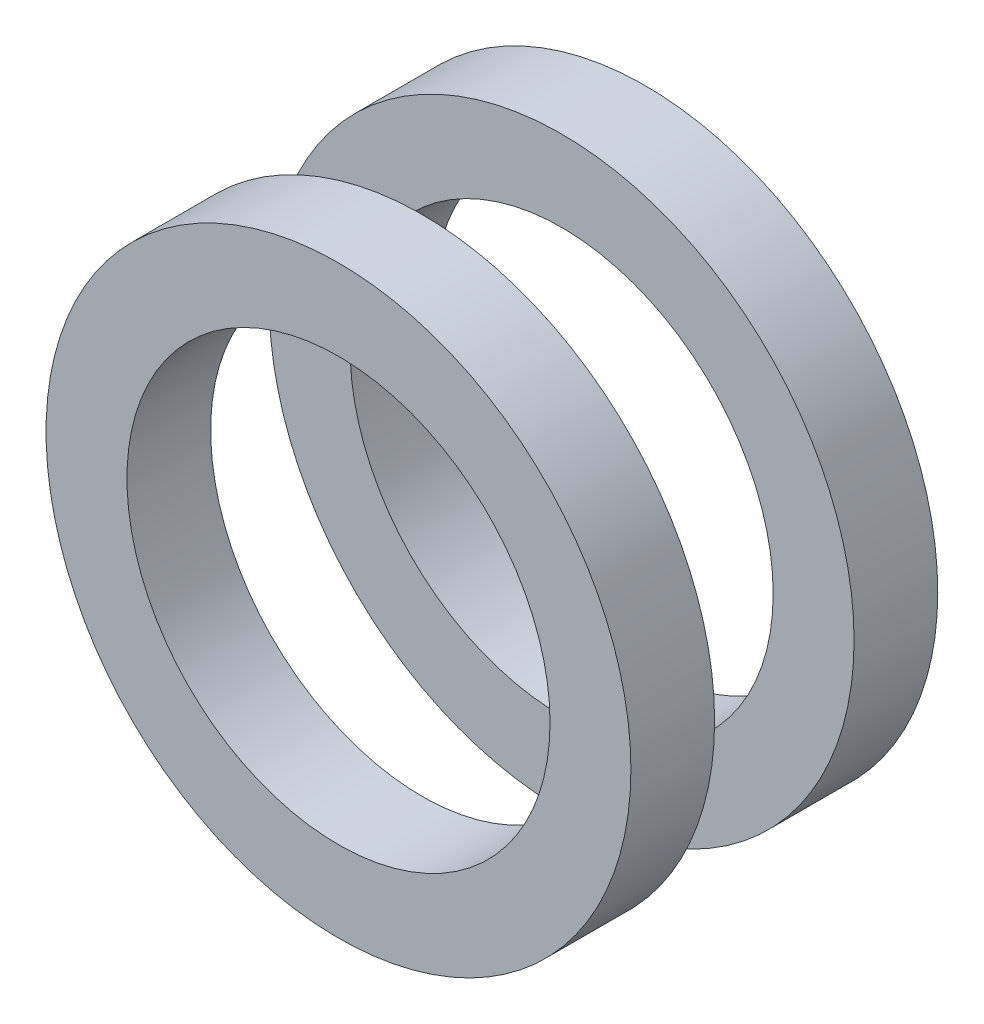
ISO-10303-21;
HEADER;
FILE_DESCRIPTION(('STEP AP214'),'2;1');
FILE_NAME('part.step','',(''),(''),'','','');
FILE_SCHEMA(('AUTOMOTIVE_DESIGN { 1 0 10303 214 1 1 1 1 }'));
ENDSEC;
DATA;
#1=APPLICATION_CONTEXT('core data for automotive mechanical design processes');
#2=APPLICATION_PROTOCOL_DEFINITION('international standard','automotive_design',2000,#1);
#3=PRODUCT_CONTEXT('',#1,'mechanical');
#4=PRODUCT('Part','Part','',(#3));
#5=PRODUCT_RELATED_PRODUCT_CATEGORY('part','',(#4));
#6=PRODUCT_DEFINITION_FORMATION('','',#4);
#7=PRODUCT_DEFINITION_CONTEXT('part definition',#1,'design');
#8=PRODUCT_DEFINITION('design','',#6,#7);
#9=PRODUCT_DEFINITION_SHAPE('','',#8);
#10=(LENGTH_UNIT() NAMED_UNIT(*) SI_UNIT(.MILLI.,.METRE.));
#11=(NAMED_UNIT(*) PLANE_ANGLE_UNIT() SI_UNIT($,.RADIAN.));
#12=(NAMED_UNIT(*) SI_UNIT($,.STERADIAN.) SOLID_ANGLE_UNIT());
#13=UNCERTAINTY_MEASURE_WITH_UNIT(LENGTH_MEASURE(1.E-05),#10,'distance_accuracy_value','');
#14=(GEOMETRIC_REPRESENTATION_CONTEXT(3) GLOBAL_UNCERTAINTY_ASSIGNED_CONTEXT((#13)) GLOBAL_UNIT_ASSIGNED_CONTEXT((#10,
#11,#12)) REPRESENTATION_CONTEXT('',''));
#15=CARTESIAN_POINT('',(0.,0.,0.));
#16=DIRECTION('',(0.,0.,1.));
#17=DIRECTION('',(1.,0.,0.));
#18=AXIS2_PLACEMENT_3D('',#15,#16,#17);
#19=CARTESIAN_POINT('',(0.,0.,-15.));
#20=DIRECTION('',(0.,0.,1.));
#21=DIRECTION('',(1.,0.,0.));
#22=AXIS2_PLACEMENT_3D('',#19,#20,#21);
#23=PLANE('',#22);
#24=CARTESIAN_POINT('',(0.,0.,-15.));
#25=DIRECTION('',(0.,0.,1.));
#26=DIRECTION('',(1.,0.,0.));
#27=AXIS2_PLACEMENT_3D('',#24,#25,#26);
#28=CIRCLE('',#27,62.9);
#29=CARTESIAN_POINT('',(62.9,0.,-15.));
#30=VERTEX_POINT('',#29);
#31=EDGE_CURVE('E11',#30,#30,#28,.T.);
#32=ORIENTED_EDGE('',*,*,#31,.T.);
#33=EDGE_LOOP('',(#32));
#34=FACE_BOUND('',#33,.T.);
#35=CARTESIAN_POINT('',(0.,0.,-15.));
#36=DIRECTION('',(0.,0.,1.));
#37=DIRECTION('',(1.,0.,0.));
#38=AXIS2_PLACEMENT_3D('',#35,#36,#37);
#39=CIRCLE('',#38,45.5);
#40=CARTESIAN_POINT('',(45.5,0.,-15.));
#41=VERTEX_POINT('',#40);
#42=EDGE_CURVE('E54',#41,#41,#39,.T.);
#43=ORIENTED_EDGE('',*,*,#42,.F.);
#44=EDGE_LOOP('',(#43));
#45=FACE_BOUND('',#44,.T.);
#46=ADVANCED_FACE('F43',(#34,#45),#23,.T.);
#47=CARTESIAN_POINT('',(0.,0.,-33.));
#48=DIRECTION('',(0.,0.,1.));
#49=DIRECTION('',(1.,0.,0.));
#50=AXIS2_PLACEMENT_3D('',#47,#48,#49);
#51=PLANE('',#50);
#52=CARTESIAN_POINT('',(0.,0.,-33.));
#53=DIRECTION('',(0.,0.,1.));
#54=DIRECTION('',(1.,0.,0.));
#55=AXIS2_PLACEMENT_3D('',#52,#53,#54);
#56=CIRCLE('',#55,62.9);
#57=CARTESIAN_POINT('',(62.9,0.,-33.));
#58=VERTEX_POINT('',#57);
#59=EDGE_CURVE('E47',#58,#58,#56,.T.);
#60=ORIENTED_EDGE('',*,*,#59,.F.);
#61=EDGE_LOOP('',(#60));
#62=FACE_BOUND('',#61,.T.);
#63=CARTESIAN_POINT('',(0.,0.,-33.));
#64=DIRECTION('',(0.,0.,1.));
#65=DIRECTION('',(1.,0.,0.));
#66=AXIS2_PLACEMENT_3D('',#63,#64,#65);
#67=CIRCLE('',#66,45.5);
#68=CARTESIAN_POINT('',(45.5,0.,-33.));
#69=VERTEX_POINT('',#68);
#70=EDGE_CURVE('E56',#69,#69,#67,.T.);
#71=ORIENTED_EDGE('',*,*,#70,.T.);
#72=EDGE_LOOP('',(#71));
#73=FACE_BOUND('',#72,.T.);
#74=ADVANCED_FACE('F66',(#62,#73),#51,.F.);
#75=CARTESIAN_POINT('',(0.,0.,-15.));
#76=DIRECTION('',(0.,0.,-1.));
#77=DIRECTION('',(-1.,0.,0.));
#78=AXIS2_PLACEMENT_3D('',#75,#76,#77);
#79=CYLINDRICAL_SURFACE('',#78,62.9);
#80=ORIENTED_EDGE('',*,*,#31,.F.);
#81=EDGE_LOOP('',(#80));
#82=FACE_BOUND('',#81,.T.);
#83=ORIENTED_EDGE('',*,*,#59,.T.);
#84=EDGE_LOOP('',(#83));
#85=FACE_BOUND('',#84,.T.);
#86=ADVANCED_FACE('F45',(#82,#85),#79,.T.);
#87=CARTESIAN_POINT('',(0.,0.,-15.));
#88=DIRECTION('',(0.,0.,-1.));
#89=DIRECTION('',(-1.,0.,0.));
#90=AXIS2_PLACEMENT_3D('',#87,#88,#89);
#91=CYLINDRICAL_SURFACE('',#90,45.5);
#92=ORIENTED_EDGE('',*,*,#42,.T.);
#93=EDGE_LOOP('',(#92));
#94=FACE_BOUND('',#93,.T.);
#95=ORIENTED_EDGE('',*,*,#70,.F.);
#96=EDGE_LOOP('',(#95));
#97=FACE_BOUND('',#96,.T.);
#98=ADVANCED_FACE('F62',(#94,#97),#91,.F.);
#99=CLOSED_SHELL('',(#46,#74,#86,#98));
#100=MANIFOLD_SOLID_BREP('B2',#99);
#101=CARTESIAN_POINT('',(0.,0.,33.));
#102=DIRECTION('',(0.,0.,1.));
#103=DIRECTION('',(1.,0.,0.));
#104=AXIS2_PLACEMENT_3D('',#101,#102,#103);
#105=PLANE('',#104);
#106=CARTESIAN_POINT('',(0.,0.,33.));
#107=DIRECTION('',(0.,0.,1.));
#108=DIRECTION('',(1.,0.,0.));
#109=AXIS2_PLACEMENT_3D('',#106,#107,#108);
#110=CIRCLE('',#109,62.9);
#111=CARTESIAN_POINT('',(62.9,0.,33.));
#112=VERTEX_POINT('',#111);
#113=EDGE_CURVE('E42',#112,#112,#110,.T.);
#114=ORIENTED_EDGE('',*,*,#113,.T.);
#115=EDGE_LOOP('',(#114));
#116=FACE_BOUND('',#115,.T.);
#117=CARTESIAN_POINT('',(0.,0.,33.));
#118=DIRECTION('',(0.,0.,1.));
#119=DIRECTION('',(1.,0.,0.));
#120=AXIS2_PLACEMENT_3D('',#117,#118,#119);
#121=CIRCLE('',#120,45.5);
#122=CARTESIAN_POINT('',(45.5,0.,33.));
#123=VERTEX_POINT('',#122);
#124=EDGE_CURVE('E116',#123,#123,#121,.T.);
#125=ORIENTED_EDGE('',*,*,#124,.F.);
#126=EDGE_LOOP('',(#125));
#127=FACE_BOUND('',#126,.T.);
#128=ADVANCED_FACE('F105',(#116,#127),#105,.T.);
#129=CARTESIAN_POINT('',(0.,0.,15.));
#130=DIRECTION('',(0.,0.,1.));
#131=DIRECTION('',(1.,0.,0.));
#132=AXIS2_PLACEMENT_3D('',#129,#130,#131);
#133=PLANE('',#132);
#134=CARTESIAN_POINT('',(0.,0.,15.));
#135=DIRECTION('',(0.,0.,1.));
#136=DIRECTION('',(1.,0.,0.));
#137=AXIS2_PLACEMENT_3D('',#134,#135,#136);
#138=CIRCLE('',#137,62.9);
#139=CARTESIAN_POINT('',(62.9,0.,15.));
#140=VERTEX_POINT('',#139);
#141=EDGE_CURVE('E109',#140,#140,#138,.T.);
#142=ORIENTED_EDGE('',*,*,#141,.F.);
#143=EDGE_LOOP('',(#142));
#144=FACE_BOUND('',#143,.T.);
#145=CARTESIAN_POINT('',(0.,0.,15.));
#146=DIRECTION('',(0.,0.,1.));
#147=DIRECTION('',(1.,0.,0.));
#148=AXIS2_PLACEMENT_3D('',#145,#146,#147);
#149=CIRCLE('',#148,45.5);
#150=CARTESIAN_POINT('',(45.5,0.,15.));
#151=VERTEX_POINT('',#150);
#152=EDGE_CURVE('E118',#151,#151,#149,.T.);
#153=ORIENTED_EDGE('',*,*,#152,.T.);
#154=EDGE_LOOP('',(#153));
#155=FACE_BOUND('',#154,.T.);
#156=ADVANCED_FACE('F128',(#144,#155),#133,.F.);
#157=CARTESIAN_POINT('',(0.,0.,33.));
#158=DIRECTION('',(0.,0.,-1.));
#159=DIRECTION('',(-1.,0.,0.));
#160=AXIS2_PLACEMENT_3D('',#157,#158,#159);
#161=CYLINDRICAL_SURFACE('',#160,62.9);
#162=ORIENTED_EDGE('',*,*,#113,.F.);
#163=EDGE_LOOP('',(#162));
#164=FACE_BOUND('',#163,.T.);
#165=ORIENTED_EDGE('',*,*,#141,.T.);
#166=EDGE_LOOP('',(#165));
#167=FACE_BOUND('',#166,.T.);
#168=ADVANCED_FACE('F107',(#164,#167),#161,.T.);
#169=CARTESIAN_POINT('',(0.,0.,33.));
#170=DIRECTION('',(0.,0.,-1.));
#171=DIRECTION('',(-1.,0.,0.));
#172=AXIS2_PLACEMENT_3D('',#169,#170,#171);
#173=CYLINDRICAL_SURFACE('',#172,45.5);
#174=ORIENTED_EDGE('',*,*,#124,.T.);
#175=EDGE_LOOP('',(#174));
#176=FACE_BOUND('',#175,.T.);
#177=ORIENTED_EDGE('',*,*,#152,.F.);
#178=EDGE_LOOP('',(#177));
#179=FACE_BOUND('',#178,.T.);
#180=ADVANCED_FACE('F124',(#176,#179),#173,.F.);
#181=CLOSED_SHELL('',(#128,#156,#168,#180));
#182=MANIFOLD_SOLID_BREP('B6',#181);
#183=ADVANCED_BREP_SHAPE_REPRESENTATION('',(#18,#100,#182),#14);
#184=SHAPE_DEFINITION_REPRESENTATION(#9,#183);
ENDSEC;
END-ISO-10303-21;
